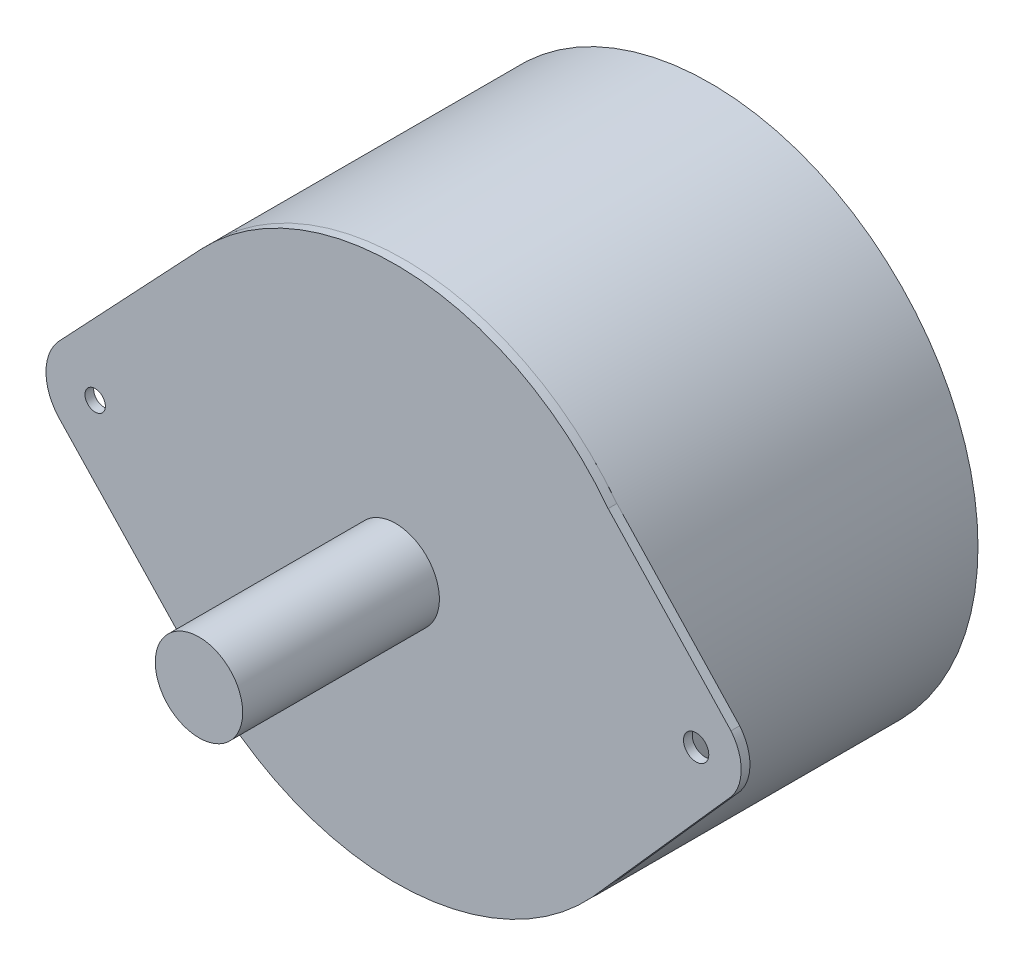
ISO-10303-21;
HEADER;
FILE_DESCRIPTION(('STEP AP214'),'2;1');
FILE_NAME('part.step','',(''),(''),'','','');
FILE_SCHEMA(('AUTOMOTIVE_DESIGN { 1 0 10303 214 1 1 1 1 }'));
ENDSEC;
DATA;
#1=APPLICATION_CONTEXT('core data for automotive mechanical design processes');
#2=APPLICATION_PROTOCOL_DEFINITION('international standard','automotive_design',2000,#1);
#3=PRODUCT_CONTEXT('',#1,'mechanical');
#4=PRODUCT('Part','Part','',(#3));
#5=PRODUCT_RELATED_PRODUCT_CATEGORY('part','',(#4));
#6=PRODUCT_DEFINITION_FORMATION('','',#4);
#7=PRODUCT_DEFINITION_CONTEXT('part definition',#1,'design');
#8=PRODUCT_DEFINITION('design','',#6,#7);
#9=PRODUCT_DEFINITION_SHAPE('','',#8);
#10=(LENGTH_UNIT() NAMED_UNIT(*) SI_UNIT(.MILLI.,.METRE.));
#11=(NAMED_UNIT(*) PLANE_ANGLE_UNIT() SI_UNIT($,.RADIAN.));
#12=(NAMED_UNIT(*) SI_UNIT($,.STERADIAN.) SOLID_ANGLE_UNIT());
#13=UNCERTAINTY_MEASURE_WITH_UNIT(LENGTH_MEASURE(1.E-05),#10,'distance_accuracy_value','');
#14=(GEOMETRIC_REPRESENTATION_CONTEXT(3) GLOBAL_UNCERTAINTY_ASSIGNED_CONTEXT((#13)) GLOBAL_UNIT_ASSIGNED_CONTEXT((#10,
#11,#12)) REPRESENTATION_CONTEXT('',''));
#15=CARTESIAN_POINT('',(0.,0.,0.));
#16=DIRECTION('',(0.,0.,1.));
#17=DIRECTION('',(1.,0.,0.));
#18=AXIS2_PLACEMENT_3D('',#15,#16,#17);
#19=CARTESIAN_POINT('',(-32.8038512921315,-8.48776301218161,28.8));
#20=DIRECTION('',(0.,0.,-1.));
#21=DIRECTION('',(-1.,0.,0.));
#22=AXIS2_PLACEMENT_3D('',#19,#20,#21);
#23=PLANE('',#22);
#24=CARTESIAN_POINT('',(-32.8038512921315,-8.48776301218161,28.8));
#25=DIRECTION('',(0.,0.,1.));
#26=DIRECTION('',(-1.,0.,0.));
#27=AXIS2_PLACEMENT_3D('',#24,#25,#26);
#28=CIRCLE('',#27,4.5);
#29=CARTESIAN_POINT('',(-36.241671320036,-5.58407682808068,28.8));
#30=VERTEX_POINT('',#29);
#31=CARTESIAN_POINT('',(-36.1463519277406,-11.5006834394336,28.8));
#32=VERTEX_POINT('',#31);
#33=EDGE_CURVE('E154',#30,#32,#28,.T.);
#34=ORIENTED_EDGE('',*,*,#33,.T.);
#35=DIRECTION('',(0.686905959330845,-0.726746312708755,0.));
#36=VECTOR('',#35,1.);
#37=CARTESIAN_POINT('',(-36.1463519277406,-11.5006834394336,28.8));
#38=LINE('',#37,#36);
#39=CARTESIAN_POINT('',(-23.7007287850542,-24.6681492408967,28.8));
#40=VERTEX_POINT('',#39);
#41=EDGE_CURVE('E102',#32,#40,#38,.T.);
#42=ORIENTED_EDGE('',*,*,#41,.T.);
#43=CARTESIAN_POINT('',(-5.30385129213149,-8.48776301218163,28.8));
#44=DIRECTION('',(0.,0.,1.));
#45=DIRECTION('',(1.,0.,0.));
#46=AXIS2_PLACEMENT_3D('',#43,#44,#45);
#47=CIRCLE('',#46,24.5);
#48=CARTESIAN_POINT('',(12.7049203597905,-25.0990285747127,28.8));
#49=VERTEX_POINT('',#48);
#50=EDGE_CURVE('E185',#40,#49,#47,.T.);
#51=ORIENTED_EDGE('',*,*,#50,.T.);
#52=DIRECTION('',(0.663897949263595,0.747823182954095,0.));
#53=VECTOR('',#52,1.);
#54=CARTESIAN_POINT('',(25.111514011652,-11.1240820266109,28.8));
#55=LINE('',#54,#53);
#56=CARTESIAN_POINT('',(25.111514011652,-11.1240820266109,28.8));
#57=VERTEX_POINT('',#56);
#58=EDGE_CURVE('E184',#49,#57,#55,.T.);
#59=ORIENTED_EDGE('',*,*,#58,.T.);
#60=CARTESIAN_POINT('',(22.1961487078685,-8.20317945813156,28.8));
#61=DIRECTION('',(0.,0.,1.));
#62=DIRECTION('',(1.,0.,0.));
#63=AXIS2_PLACEMENT_3D('',#60,#61,#62);
#64=CIRCLE('',#63,4.12686644671884);
#65=CARTESIAN_POINT('',(25.3854006706827,-5.58407682808068,28.8));
#66=VERTEX_POINT('',#65);
#67=EDGE_CURVE('E121',#57,#66,#64,.T.);
#68=ORIENTED_EDGE('',*,*,#67,.T.);
#69=DIRECTION('',(-0.683775822523687,0.72969214366886,0.));
#70=VECTOR('',#69,1.);
#71=CARTESIAN_POINT('',(25.3854006706827,-5.58407682808068,28.8));
#72=LINE('',#71,#70);
#73=CARTESIAN_POINT('',(14.1471377892138,6.4088481379219,28.8));
#74=VERTEX_POINT('',#73);
#75=EDGE_CURVE('E115',#66,#74,#72,.T.);
#76=ORIENTED_EDGE('',*,*,#75,.T.);
#77=CARTESIAN_POINT('',(-5.3006113678058,-8.42578890260488,28.8));
#78=DIRECTION('',(0.,0.,1.));
#79=DIRECTION('',(-1.,0.,0.));
#80=AXIS2_PLACEMENT_3D('',#77,#78,#79);
#81=CIRCLE('',#80,24.4597915649035);
#82=CARTESIAN_POINT('',(-23.0955038227446,8.35584409051256,28.8));
#83=VERTEX_POINT('',#82);
#84=EDGE_CURVE('E119',#74,#83,#81,.T.);
#85=ORIENTED_EDGE('',*,*,#84,.T.);
#86=DIRECTION('',(-0.68609059683063,-0.727516111808247,0.));
#87=VECTOR('',#86,1.);
#88=CARTESIAN_POINT('',(-36.241671320036,-5.58407682808068,28.8));
#89=LINE('',#88,#87);
#90=EDGE_CURVE('E58',#83,#30,#89,.T.);
#91=ORIENTED_EDGE('',*,*,#90,.T.);
#92=EDGE_LOOP('',(#34,#42,#51,#59,#68,#76,#85,#91));
#93=FACE_BOUND('',#92,.T.);
#94=CARTESIAN_POINT('',(-32.8038512921315,-8.48776301218161,28.8));
#95=DIRECTION('',(0.,0.,1.));
#96=DIRECTION('',(1.,0.,0.));
#97=AXIS2_PLACEMENT_3D('',#94,#95,#96);
#98=CIRCLE('',#97,0.9338363408245);
#99=CARTESIAN_POINT('',(-31.870014951307,-8.48776301218161,28.8));
#100=VERTEX_POINT('',#99);
#101=EDGE_CURVE('E191',#100,#100,#98,.T.);
#102=ORIENTED_EDGE('',*,*,#101,.F.);
#103=EDGE_LOOP('',(#102));
#104=FACE_BOUND('',#103,.T.);
#105=CARTESIAN_POINT('',(22.1993886321942,-8.48776301218161,28.8));
#106=DIRECTION('',(0.,0.,1.));
#107=DIRECTION('',(1.,0.,0.));
#108=AXIS2_PLACEMENT_3D('',#105,#106,#107);
#109=CIRCLE('',#108,1.1578570806257);
#110=CARTESIAN_POINT('',(23.3572457128199,-8.48776301218161,28.8));
#111=VERTEX_POINT('',#110);
#112=EDGE_CURVE('E197',#111,#111,#109,.T.);
#113=ORIENTED_EDGE('',*,*,#112,.F.);
#114=EDGE_LOOP('',(#113));
#115=FACE_BOUND('',#114,.T.);
#116=CARTESIAN_POINT('',(-5.30061136780585,-8.48776301218162,28.8));
#117=DIRECTION('',(0.,0.,-1.));
#118=DIRECTION('',(-1.,0.,0.));
#119=AXIS2_PLACEMENT_3D('',#116,#117,#118);
#120=CIRCLE('',#119,4.);
#121=CARTESIAN_POINT('',(-9.30061136780584,-8.48776301218162,28.8));
#122=VERTEX_POINT('',#121);
#123=EDGE_CURVE('E12',#122,#122,#120,.F.);
#124=ORIENTED_EDGE('',*,*,#123,.F.);
#125=EDGE_LOOP('',(#124));
#126=FACE_BOUND('',#125,.T.);
#127=ADVANCED_FACE('F41',(#93,#104,#115,#126),#23,.F.);
#128=CARTESIAN_POINT('',(-32.8038512921315,-8.48776301218161,28.8));
#129=DIRECTION('',(0.,0.,-1.));
#130=DIRECTION('',(-1.,0.,0.));
#131=AXIS2_PLACEMENT_3D('',#128,#129,#130);
#132=CYLINDRICAL_SURFACE('',#131,4.5);
#133=CARTESIAN_POINT('',(-32.8038512921315,-8.48776301218161,28.));
#134=DIRECTION('',(0.,0.,1.));
#135=DIRECTION('',(-1.,0.,0.));
#136=AXIS2_PLACEMENT_3D('',#133,#134,#135);
#137=CIRCLE('',#136,4.5);
#138=CARTESIAN_POINT('',(-36.241671320036,-5.58407682808068,28.));
#139=VERTEX_POINT('',#138);
#140=CARTESIAN_POINT('',(-36.1463519277406,-11.5006834394336,28.));
#141=VERTEX_POINT('',#140);
#142=EDGE_CURVE('E139',#139,#141,#137,.T.);
#143=ORIENTED_EDGE('',*,*,#142,.T.);
#144=DIRECTION('',(0.,0.,-1.));
#145=VECTOR('',#144,1.);
#146=CARTESIAN_POINT('',(-36.1463519277406,-11.5006834394336,28.8));
#147=LINE('',#146,#145);
#148=EDGE_CURVE('E50',#32,#141,#147,.T.);
#149=ORIENTED_EDGE('',*,*,#148,.F.);
#150=ORIENTED_EDGE('',*,*,#33,.F.);
#151=DIRECTION('',(0.,0.,-1.));
#152=VECTOR('',#151,1.);
#153=CARTESIAN_POINT('',(-36.241671320036,-5.58407682808068,28.8));
#154=LINE('',#153,#152);
#155=EDGE_CURVE('E135',#30,#139,#154,.T.);
#156=ORIENTED_EDGE('',*,*,#155,.T.);
#157=EDGE_LOOP('',(#143,#149,#150,#156));
#158=FACE_BOUND('',#157,.T.);
#159=ADVANCED_FACE('F43',(#158),#132,.T.);
#160=CARTESIAN_POINT('',(-36.1463519277406,-11.5006834394336,28.8));
#161=DIRECTION('',(0.726746312708755,0.686905959330845,0.));
#162=DIRECTION('',(-0.686905959330845,0.726746312708755,0.));
#163=AXIS2_PLACEMENT_3D('',#160,#161,#162);
#164=PLANE('',#163);
#165=DIRECTION('',(0.686905959330845,-0.726746312708755,0.));
#166=VECTOR('',#165,1.);
#167=CARTESIAN_POINT('',(-36.1463519277406,-11.5006834394336,28.));
#168=LINE('',#167,#166);
#169=CARTESIAN_POINT('',(-23.7007287850542,-24.6681492408967,28.));
#170=VERTEX_POINT('',#169);
#171=EDGE_CURVE('E142',#141,#170,#168,.T.);
#172=ORIENTED_EDGE('',*,*,#171,.T.);
#173=DIRECTION('',(0.,0.,-1.));
#174=VECTOR('',#173,1.);
#175=CARTESIAN_POINT('',(-23.7007287850542,-24.6681492408967,28.8));
#176=LINE('',#175,#174);
#177=EDGE_CURVE('E164',#40,#170,#176,.T.);
#178=ORIENTED_EDGE('',*,*,#177,.F.);
#179=ORIENTED_EDGE('',*,*,#41,.F.);
#180=ORIENTED_EDGE('',*,*,#148,.T.);
#181=EDGE_LOOP('',(#172,#178,#179,#180));
#182=FACE_BOUND('',#181,.T.);
#183=ADVANCED_FACE('F167',(#182),#164,.F.);
#184=CARTESIAN_POINT('',(-5.30385129213149,-8.48776301218163,28.8));
#185=DIRECTION('',(0.,0.,-1.));
#186=DIRECTION('',(-1.,0.,0.));
#187=AXIS2_PLACEMENT_3D('',#184,#185,#186);
#188=CYLINDRICAL_SURFACE('',#187,24.5);
#189=CARTESIAN_POINT('',(-5.30385129213149,-8.48776301218163,28.));
#190=DIRECTION('',(0.,0.,1.));
#191=DIRECTION('',(1.,0.,0.));
#192=AXIS2_PLACEMENT_3D('',#189,#190,#191);
#193=CIRCLE('',#192,24.5);
#194=CARTESIAN_POINT('',(12.7049203597905,-25.0990285747127,28.));
#195=VERTEX_POINT('',#194);
#196=EDGE_CURVE('E145',#170,#195,#193,.T.);
#197=ORIENTED_EDGE('',*,*,#196,.T.);
#198=DIRECTION('',(0.,0.,-1.));
#199=VECTOR('',#198,1.);
#200=CARTESIAN_POINT('',(12.7049203597905,-25.0990285747127,28.8));
#201=LINE('',#200,#199);
#202=EDGE_CURVE('E161',#49,#195,#201,.T.);
#203=ORIENTED_EDGE('',*,*,#202,.F.);
#204=ORIENTED_EDGE('',*,*,#50,.F.);
#205=ORIENTED_EDGE('',*,*,#177,.T.);
#206=EDGE_LOOP('',(#197,#203,#204,#205));
#207=FACE_BOUND('',#206,.T.);
#208=ADVANCED_FACE('F178',(#207),#188,.T.);
#209=CARTESIAN_POINT('',(25.111514011652,-11.1240820266109,28.8));
#210=DIRECTION('',(-0.747823182954095,0.663897949263595,0.));
#211=DIRECTION('',(-0.663897949263595,-0.747823182954095,0.));
#212=AXIS2_PLACEMENT_3D('',#209,#210,#211);
#213=PLANE('',#212);
#214=DIRECTION('',(0.663897949263595,0.747823182954095,0.));
#215=VECTOR('',#214,1.);
#216=CARTESIAN_POINT('',(25.111514011652,-11.1240820266109,28.));
#217=LINE('',#216,#215);
#218=CARTESIAN_POINT('',(25.111514011652,-11.1240820266109,28.));
#219=VERTEX_POINT('',#218);
#220=EDGE_CURVE('E147',#195,#219,#217,.T.);
#221=ORIENTED_EDGE('',*,*,#220,.T.);
#222=DIRECTION('',(0.,0.,-1.));
#223=VECTOR('',#222,1.);
#224=CARTESIAN_POINT('',(25.111514011652,-11.1240820266109,28.8));
#225=LINE('',#224,#223);
#226=EDGE_CURVE('E158',#57,#219,#225,.T.);
#227=ORIENTED_EDGE('',*,*,#226,.F.);
#228=ORIENTED_EDGE('',*,*,#58,.F.);
#229=ORIENTED_EDGE('',*,*,#202,.T.);
#230=EDGE_LOOP('',(#221,#227,#228,#229));
#231=FACE_BOUND('',#230,.T.);
#232=ADVANCED_FACE('F182',(#231),#213,.F.);
#233=CARTESIAN_POINT('',(22.1961487078685,-8.20317945813156,28.8));
#234=DIRECTION('',(0.,0.,-1.));
#235=DIRECTION('',(-1.,0.,0.));
#236=AXIS2_PLACEMENT_3D('',#233,#234,#235);
#237=CYLINDRICAL_SURFACE('',#236,4.12686644671884);
#238=CARTESIAN_POINT('',(22.1961487078685,-8.20317945813156,28.));
#239=DIRECTION('',(0.,0.,1.));
#240=DIRECTION('',(1.,0.,0.));
#241=AXIS2_PLACEMENT_3D('',#238,#239,#240);
#242=CIRCLE('',#241,4.12686644671884);
#243=CARTESIAN_POINT('',(25.3854006706827,-5.58407682808068,28.));
#244=VERTEX_POINT('',#243);
#245=EDGE_CURVE('E149',#219,#244,#242,.T.);
#246=ORIENTED_EDGE('',*,*,#245,.T.);
#247=DIRECTION('',(0.,0.,-1.));
#248=VECTOR('',#247,1.);
#249=CARTESIAN_POINT('',(25.3854006706827,-5.58407682808068,28.8));
#250=LINE('',#249,#248);
#251=EDGE_CURVE('E130',#66,#244,#250,.T.);
#252=ORIENTED_EDGE('',*,*,#251,.F.);
#253=ORIENTED_EDGE('',*,*,#67,.F.);
#254=ORIENTED_EDGE('',*,*,#226,.T.);
#255=EDGE_LOOP('',(#246,#252,#253,#254));
#256=FACE_BOUND('',#255,.T.);
#257=ADVANCED_FACE('F234',(#256),#237,.T.);
#258=CARTESIAN_POINT('',(25.3854006706827,-5.58407682808068,28.8));
#259=DIRECTION('',(-0.72969214366886,-0.683775822523687,0.));
#260=DIRECTION('',(0.683775822523687,-0.72969214366886,0.));
#261=AXIS2_PLACEMENT_3D('',#258,#259,#260);
#262=PLANE('',#261);
#263=DIRECTION('',(-0.683775822523687,0.72969214366886,0.));
#264=VECTOR('',#263,1.);
#265=CARTESIAN_POINT('',(25.3854006706827,-5.58407682808068,28.));
#266=LINE('',#265,#264);
#267=CARTESIAN_POINT('',(14.1471377892138,6.4088481379219,28.));
#268=VERTEX_POINT('',#267);
#269=EDGE_CURVE('E129',#244,#268,#266,.T.);
#270=ORIENTED_EDGE('',*,*,#269,.T.);
#271=DIRECTION('',(0.,0.,-1.));
#272=VECTOR('',#271,1.);
#273=CARTESIAN_POINT('',(14.1471377892138,6.4088481379219,28.8));
#274=LINE('',#273,#272);
#275=EDGE_CURVE('E126',#74,#268,#274,.T.);
#276=ORIENTED_EDGE('',*,*,#275,.F.);
#277=ORIENTED_EDGE('',*,*,#75,.F.);
#278=ORIENTED_EDGE('',*,*,#251,.T.);
#279=EDGE_LOOP('',(#270,#276,#277,#278));
#280=FACE_BOUND('',#279,.T.);
#281=ADVANCED_FACE('F127',(#280),#262,.F.);
#282=CARTESIAN_POINT('',(-5.3006113678058,-8.42578890260488,28.8));
#283=DIRECTION('',(0.,0.,-1.));
#284=DIRECTION('',(-1.,0.,0.));
#285=AXIS2_PLACEMENT_3D('',#282,#283,#284);
#286=CYLINDRICAL_SURFACE('',#285,24.4597915649035);
#287=CARTESIAN_POINT('',(-5.3006113678058,-8.42578890260488,28.));
#288=DIRECTION('',(0.,0.,1.));
#289=DIRECTION('',(-1.,0.,0.));
#290=AXIS2_PLACEMENT_3D('',#287,#288,#289);
#291=CIRCLE('',#290,24.4597915649035);
#292=CARTESIAN_POINT('',(-23.0955038227446,8.35584409051256,28.));
#293=VERTEX_POINT('',#292);
#294=EDGE_CURVE('E87',#268,#293,#291,.T.);
#295=ORIENTED_EDGE('',*,*,#294,.T.);
#296=DIRECTION('',(0.,0.,-1.));
#297=VECTOR('',#296,1.);
#298=CARTESIAN_POINT('',(-23.0955038227446,8.35584409051256,28.8));
#299=LINE('',#298,#297);
#300=EDGE_CURVE('E131',#83,#293,#299,.T.);
#301=ORIENTED_EDGE('',*,*,#300,.F.);
#302=ORIENTED_EDGE('',*,*,#84,.F.);
#303=ORIENTED_EDGE('',*,*,#275,.T.);
#304=EDGE_LOOP('',(#295,#301,#302,#303));
#305=FACE_BOUND('',#304,.T.);
#306=ADVANCED_FACE('F133',(#305),#286,.T.);
#307=CARTESIAN_POINT('',(-36.241671320036,-5.58407682808068,28.8));
#308=DIRECTION('',(0.727516111808247,-0.68609059683063,0.));
#309=DIRECTION('',(0.68609059683063,0.727516111808247,0.));
#310=AXIS2_PLACEMENT_3D('',#307,#308,#309);
#311=PLANE('',#310);
#312=DIRECTION('',(-0.68609059683063,-0.727516111808247,0.));
#313=VECTOR('',#312,1.);
#314=CARTESIAN_POINT('',(-36.241671320036,-5.58407682808068,28.));
#315=LINE('',#314,#313);
#316=EDGE_CURVE('E93',#293,#139,#315,.T.);
#317=ORIENTED_EDGE('',*,*,#316,.T.);
#318=ORIENTED_EDGE('',*,*,#155,.F.);
#319=ORIENTED_EDGE('',*,*,#90,.F.);
#320=ORIENTED_EDGE('',*,*,#300,.T.);
#321=EDGE_LOOP('',(#317,#318,#319,#320));
#322=FACE_BOUND('',#321,.T.);
#323=ADVANCED_FACE('F226',(#322),#311,.F.);
#324=CARTESIAN_POINT('',(-32.8038512921315,-8.48776301218161,28.));
#325=DIRECTION('',(0.,0.,-1.));
#326=DIRECTION('',(-1.,0.,0.));
#327=AXIS2_PLACEMENT_3D('',#324,#325,#326);
#328=PLANE('',#327);
#329=CARTESIAN_POINT('',(22.1993886321942,-8.48776301218161,28.));
#330=DIRECTION('',(0.,0.,1.));
#331=DIRECTION('',(1.,0.,0.));
#332=AXIS2_PLACEMENT_3D('',#329,#330,#331);
#333=CIRCLE('',#332,1.1578570806257);
#334=CARTESIAN_POINT('',(23.3572457128199,-8.48776301218161,28.));
#335=VERTEX_POINT('',#334);
#336=EDGE_CURVE('E194',#335,#335,#333,.T.);
#337=ORIENTED_EDGE('',*,*,#336,.T.);
#338=EDGE_LOOP('',(#337));
#339=FACE_BOUND('',#338,.T.);
#340=CARTESIAN_POINT('',(-32.8038512921315,-8.48776301218161,28.));
#341=DIRECTION('',(0.,0.,1.));
#342=DIRECTION('',(1.,0.,0.));
#343=AXIS2_PLACEMENT_3D('',#340,#341,#342);
#344=CIRCLE('',#343,0.9338363408245);
#345=CARTESIAN_POINT('',(-31.870014951307,-8.48776301218161,28.));
#346=VERTEX_POINT('',#345);
#347=EDGE_CURVE('E143',#346,#346,#344,.T.);
#348=ORIENTED_EDGE('',*,*,#347,.T.);
#349=EDGE_LOOP('',(#348));
#350=FACE_BOUND('',#349,.T.);
#351=ORIENTED_EDGE('',*,*,#142,.F.);
#352=ORIENTED_EDGE('',*,*,#316,.F.);
#353=ORIENTED_EDGE('',*,*,#294,.F.);
#354=ORIENTED_EDGE('',*,*,#269,.F.);
#355=ORIENTED_EDGE('',*,*,#245,.F.);
#356=ORIENTED_EDGE('',*,*,#220,.F.);
#357=ORIENTED_EDGE('',*,*,#196,.F.);
#358=ORIENTED_EDGE('',*,*,#171,.F.);
#359=EDGE_LOOP('',(#351,#352,#353,#354,#355,#356,#357,#358));
#360=FACE_BOUND('',#359,.T.);
#361=ADVANCED_FACE('F172',(#339,#350,#360),#328,.T.);
#362=CARTESIAN_POINT('',(-32.8038512921315,-8.48776301218161,28.));
#363=DIRECTION('',(0.,0.,1.));
#364=DIRECTION('',(1.,0.,0.));
#365=AXIS2_PLACEMENT_3D('',#362,#363,#364);
#366=CYLINDRICAL_SURFACE('',#365,0.9338363408245);
#367=ORIENTED_EDGE('',*,*,#347,.F.);
#368=EDGE_LOOP('',(#367));
#369=FACE_BOUND('',#368,.T.);
#370=ORIENTED_EDGE('',*,*,#101,.T.);
#371=EDGE_LOOP('',(#370));
#372=FACE_BOUND('',#371,.T.);
#373=ADVANCED_FACE('F222',(#369,#372),#366,.F.);
#374=CARTESIAN_POINT('',(22.1993886321942,-8.48776301218161,28.));
#375=DIRECTION('',(0.,0.,1.));
#376=DIRECTION('',(1.,0.,0.));
#377=AXIS2_PLACEMENT_3D('',#374,#375,#376);
#378=CYLINDRICAL_SURFACE('',#377,1.1578570806257);
#379=ORIENTED_EDGE('',*,*,#336,.F.);
#380=EDGE_LOOP('',(#379));
#381=FACE_BOUND('',#380,.T.);
#382=ORIENTED_EDGE('',*,*,#112,.T.);
#383=EDGE_LOOP('',(#382));
#384=FACE_BOUND('',#383,.T.);
#385=ADVANCED_FACE('F211',(#381,#384),#378,.F.);
#386=CARTESIAN_POINT('',(-5.30061136780585,-8.48776301218162,46.8));
#387=DIRECTION('',(0.,0.,-1.));
#388=DIRECTION('',(-1.,0.,0.));
#389=AXIS2_PLACEMENT_3D('',#386,#387,#388);
#390=CYLINDRICAL_SURFACE('',#389,4.);
#391=CARTESIAN_POINT('',(-5.30061136780585,-8.48776301218162,46.8));
#392=DIRECTION('',(0.,0.,1.));
#393=DIRECTION('',(1.,0.,0.));
#394=AXIS2_PLACEMENT_3D('',#391,#392,#393);
#395=CIRCLE('',#394,4.);
#396=CARTESIAN_POINT('',(-1.30061136780584,-8.48776301218162,46.8));
#397=VERTEX_POINT('',#396);
#398=EDGE_CURVE('E200',#397,#397,#395,.T.);
#399=ORIENTED_EDGE('',*,*,#398,.F.);
#400=EDGE_LOOP('',(#399));
#401=FACE_BOUND('',#400,.T.);
#402=ORIENTED_EDGE('',*,*,#123,.T.);
#403=EDGE_LOOP('',(#402));
#404=FACE_BOUND('',#403,.T.);
#405=ADVANCED_FACE('F208',(#401,#404),#390,.T.);
#406=CARTESIAN_POINT('',(-5.30061136780585,-8.48776301218162,46.8));
#407=DIRECTION('',(0.,0.,1.));
#408=DIRECTION('',(1.,0.,0.));
#409=AXIS2_PLACEMENT_3D('',#406,#407,#408);
#410=PLANE('',#409);
#411=ORIENTED_EDGE('',*,*,#398,.T.);
#412=EDGE_LOOP('',(#411));
#413=FACE_BOUND('',#412,.T.);
#414=ADVANCED_FACE('F206',(#413),#410,.T.);
#415=CLOSED_SHELL('',(#127,#159,#183,#208,#232,#257,#281,#306,#323,#361,#373,#385,#405,#414));
#416=MANIFOLD_SOLID_BREP('B2',#415);
#417=CARTESIAN_POINT('',(-5.30385129213148,-8.48776301218161,28.));
#418=DIRECTION('',(0.,0.,-1.));
#419=DIRECTION('',(-1.,0.,0.));
#420=AXIS2_PLACEMENT_3D('',#417,#418,#419);
#421=CYLINDRICAL_SURFACE('',#420,24.5);
#422=CARTESIAN_POINT('',(-5.30385129213148,-8.48776301218161,28.));
#423=DIRECTION('',(0.,0.,1.));
#424=DIRECTION('',(1.,0.,0.));
#425=AXIS2_PLACEMENT_3D('',#422,#423,#424);
#426=CIRCLE('',#425,24.5);
#427=CARTESIAN_POINT('',(19.1961487078685,-8.48776301218161,28.));
#428=VERTEX_POINT('',#427);
#429=EDGE_CURVE('E40',#428,#428,#426,.T.);
#430=ORIENTED_EDGE('',*,*,#429,.F.);
#431=EDGE_LOOP('',(#430));
#432=FACE_BOUND('',#431,.T.);
#433=CARTESIAN_POINT('',(-5.30385129213148,-8.48776301218161,0.));
#434=DIRECTION('',(0.,0.,1.));
#435=DIRECTION('',(1.,0.,0.));
#436=AXIS2_PLACEMENT_3D('',#433,#434,#435);
#437=CIRCLE('',#436,24.5);
#438=CARTESIAN_POINT('',(19.1961487078685,-8.48776301218161,0.));
#439=VERTEX_POINT('',#438);
#440=EDGE_CURVE('E344',#439,#439,#437,.T.);
#441=ORIENTED_EDGE('',*,*,#440,.T.);
#442=EDGE_LOOP('',(#441));
#443=FACE_BOUND('',#442,.T.);
#444=ADVANCED_FACE('F341',(#432,#443),#421,.T.);
#445=CARTESIAN_POINT('',(-5.30385129213148,-8.48776301218161,28.));
#446=DIRECTION('',(0.,0.,1.));
#447=DIRECTION('',(1.,0.,0.));
#448=AXIS2_PLACEMENT_3D('',#445,#446,#447);
#449=PLANE('',#448);
#450=ORIENTED_EDGE('',*,*,#429,.T.);
#451=EDGE_LOOP('',(#450));
#452=FACE_BOUND('',#451,.T.);
#453=ADVANCED_FACE('F356',(#452),#449,.T.);
#454=CARTESIAN_POINT('',(-5.30385129213148,-8.48776301218161,0.));
#455=DIRECTION('',(0.,0.,1.));
#456=DIRECTION('',(1.,0.,0.));
#457=AXIS2_PLACEMENT_3D('',#454,#455,#456);
#458=PLANE('',#457);
#459=ORIENTED_EDGE('',*,*,#440,.F.);
#460=EDGE_LOOP('',(#459));
#461=FACE_BOUND('',#460,.T.);
#462=ADVANCED_FACE('F354',(#461),#458,.F.);
#463=CLOSED_SHELL('',(#444,#453,#462));
#464=MANIFOLD_SOLID_BREP('B6',#463);
#465=ADVANCED_BREP_SHAPE_REPRESENTATION('',(#18,#416,#464),#14);
#466=SHAPE_DEFINITION_REPRESENTATION(#9,#465);
ENDSEC;
END-ISO-10303-21;
